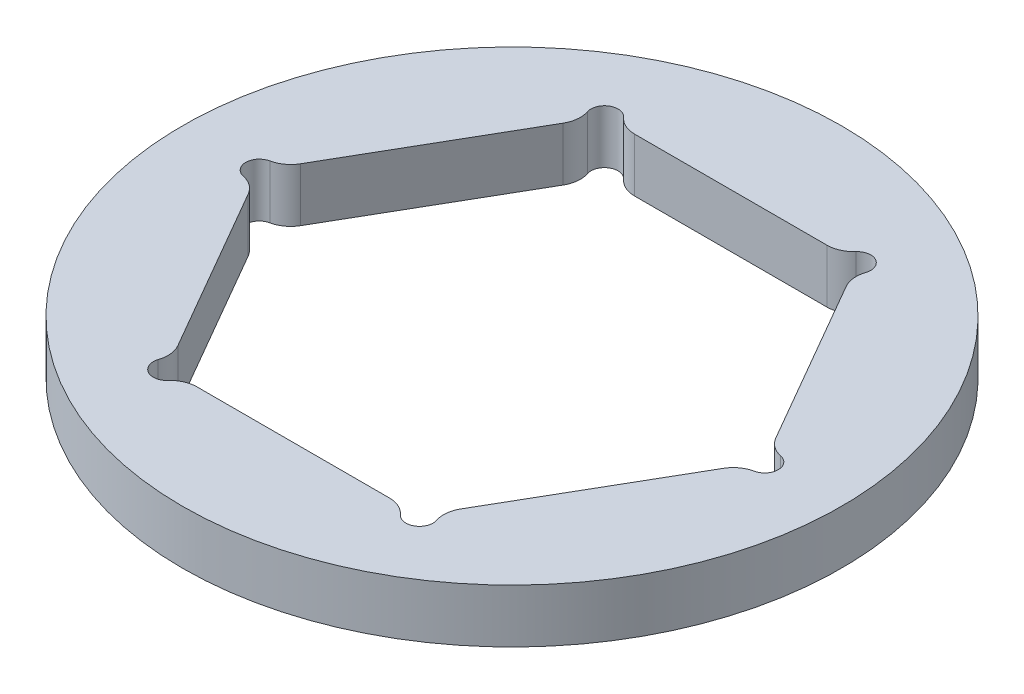
ISO-10303-21;
HEADER;
FILE_DESCRIPTION(('STEP AP214'),'2;1');
FILE_NAME('part.step','',(''),(''),'','','');
FILE_SCHEMA(('AUTOMOTIVE_DESIGN { 1 0 10303 214 1 1 1 1 }'));
ENDSEC;
DATA;
#1=APPLICATION_CONTEXT('core data for automotive mechanical design processes');
#2=APPLICATION_PROTOCOL_DEFINITION('international standard','automotive_design',2000,#1);
#3=PRODUCT_CONTEXT('',#1,'mechanical');
#4=PRODUCT('Part','Part','',(#3));
#5=PRODUCT_RELATED_PRODUCT_CATEGORY('part','',(#4));
#6=PRODUCT_DEFINITION_FORMATION('','',#4);
#7=PRODUCT_DEFINITION_CONTEXT('part definition',#1,'design');
#8=PRODUCT_DEFINITION('design','',#6,#7);
#9=PRODUCT_DEFINITION_SHAPE('','',#8);
#10=(LENGTH_UNIT() NAMED_UNIT(*) SI_UNIT(.MILLI.,.METRE.));
#11=(NAMED_UNIT(*) PLANE_ANGLE_UNIT() SI_UNIT($,.RADIAN.));
#12=(NAMED_UNIT(*) SI_UNIT($,.STERADIAN.) SOLID_ANGLE_UNIT());
#13=UNCERTAINTY_MEASURE_WITH_UNIT(LENGTH_MEASURE(1.E-05),#10,'distance_accuracy_value','');
#14=(GEOMETRIC_REPRESENTATION_CONTEXT(3) GLOBAL_UNCERTAINTY_ASSIGNED_CONTEXT((#13)) GLOBAL_UNIT_ASSIGNED_CONTEXT((#10,
#11,#12)) REPRESENTATION_CONTEXT('',''));
#15=CARTESIAN_POINT('',(0.,0.,0.));
#16=DIRECTION('',(0.,0.,1.));
#17=DIRECTION('',(1.,0.,0.));
#18=AXIS2_PLACEMENT_3D('',#15,#16,#17);
#19=CARTESIAN_POINT('',(0.,0.79375,0.));
#20=DIRECTION('',(0.,1.,0.));
#21=DIRECTION('',(0.,0.,1.));
#22=AXIS2_PLACEMENT_3D('',#19,#20,#21);
#23=PLANE('',#22);
#24=CARTESIAN_POINT('',(0.,0.79375,0.));
#25=DIRECTION('',(0.,1.,0.));
#26=DIRECTION('',(0.,0.,1.));
#27=AXIS2_PLACEMENT_3D('',#24,#25,#26);
#28=CIRCLE('',#27,9.7536);
#29=CARTESIAN_POINT('',(0.,0.79375,9.7536));
#30=VERTEX_POINT('',#29);
#31=EDGE_CURVE('E11',#30,#30,#28,.T.);
#32=ORIENTED_EDGE('',*,*,#31,.T.);
#33=EDGE_LOOP('',(#32));
#34=FACE_BOUND('',#33,.T.);
#35=CARTESIAN_POINT('',(-3.7394976935412,0.79375,-6.477));
#36=DIRECTION('',(0.,1.,0.));
#37=DIRECTION('',(0.,0.,1.));
#38=AXIS2_PLACEMENT_3D('',#35,#36,#37);
#39=CIRCLE('',#38,0.4);
#40=CARTESIAN_POINT('',(-3.44135529654123,0.79375,-6.74366666666667));
#41=VERTEX_POINT('',#40);
#42=CARTESIAN_POINT('',(-4.11950899971704,0.79375,-6.35213444358617));
#43=VERTEX_POINT('',#42);
#44=EDGE_CURVE('E203',#41,#43,#39,.T.);
#45=ORIENTED_EDGE('',*,*,#44,.F.);
#46=CARTESIAN_POINT('',(-2.84507050254129,0.79375,-7.277));
#47=DIRECTION('',(0.,-1.,0.));
#48=DIRECTION('',(0.,0.,1.));
#49=AXIS2_PLACEMENT_3D('',#46,#47,#48);
#50=CIRCLE('',#49,0.8);
#51=CARTESIAN_POINT('',(-2.84507050254129,0.79375,-6.477));
#52=VERTEX_POINT('',#51);
#53=EDGE_CURVE('E195',#52,#41,#50,.T.);
#54=ORIENTED_EDGE('',*,*,#53,.F.);
#55=DIRECTION('',(-1.,0.,0.));
#56=VECTOR('',#55,1.);
#57=CARTESIAN_POINT('',(2.84507050254129,0.79375,-6.477));
#58=LINE('',#57,#56);
#59=CARTESIAN_POINT('',(2.84507050254129,0.79375,-6.477));
#60=VERTEX_POINT('',#59);
#61=EDGE_CURVE('E259',#60,#52,#58,.T.);
#62=ORIENTED_EDGE('',*,*,#61,.F.);
#63=CARTESIAN_POINT('',(2.84507050254129,0.79375,-7.277));
#64=DIRECTION('',(0.,-1.,0.));
#65=DIRECTION('',(0.,0.,1.));
#66=AXIS2_PLACEMENT_3D('',#63,#64,#65);
#67=CIRCLE('',#66,0.800000000000002);
#68=CARTESIAN_POINT('',(3.44135529654124,0.79375,-6.74366666666666));
#69=VERTEX_POINT('',#68);
#70=EDGE_CURVE('E257',#69,#60,#67,.T.);
#71=ORIENTED_EDGE('',*,*,#70,.F.);
#72=CARTESIAN_POINT('',(3.73949769354121,0.79375,-6.477));
#73=DIRECTION('',(0.,1.,0.));
#74=DIRECTION('',(0.,0.,1.));
#75=AXIS2_PLACEMENT_3D('',#72,#73,#74);
#76=CIRCLE('',#75,0.4);
#77=CARTESIAN_POINT('',(4.11950899971704,0.79375,-6.35213444358617));
#78=VERTEX_POINT('',#77);
#79=EDGE_CURVE('E255',#78,#69,#76,.T.);
#80=ORIENTED_EDGE('',*,*,#79,.F.);
#81=CARTESIAN_POINT('',(4.87953161206872,0.79375,-6.10240333075852));
#82=DIRECTION('',(0.,-1.,0.));
#83=DIRECTION('',(0.,0.,1.));
#84=AXIS2_PLACEMENT_3D('',#81,#82,#83);
#85=CIRCLE('',#84,0.799999999999999);
#86=CARTESIAN_POINT('',(4.18671128904117,0.79375,-5.70240333075852));
#87=VERTEX_POINT('',#86);
#88=EDGE_CURVE('E253',#87,#78,#85,.T.);
#89=ORIENTED_EDGE('',*,*,#88,.F.);
#90=DIRECTION('',(-0.5,0.,-0.866025403784439));
#91=VECTOR('',#90,1.);
#92=CARTESIAN_POINT('',(7.03178179158246,0.79375,-0.77459666924148));
#93=LINE('',#92,#91);
#94=CARTESIAN_POINT('',(7.03178179158246,0.79375,-0.77459666924148));
#95=VERTEX_POINT('',#94);
#96=EDGE_CURVE('E251',#95,#87,#93,.T.);
#97=ORIENTED_EDGE('',*,*,#96,.F.);
#98=CARTESIAN_POINT('',(7.72460211461001,0.79375,-1.17459666924148));
#99=DIRECTION('',(0.,-1.,0.));
#100=DIRECTION('',(0.,0.,1.));
#101=AXIS2_PLACEMENT_3D('',#98,#99,#100);
#102=CIRCLE('',#101,0.800000000000001);
#103=CARTESIAN_POINT('',(7.56086429625828,0.79375,-0.391532223080492));
#104=VERTEX_POINT('',#103);
#105=EDGE_CURVE('E249',#104,#95,#102,.T.);
#106=ORIENTED_EDGE('',*,*,#105,.F.);
#107=CARTESIAN_POINT('',(7.47899538708241,0.79375,0.));
#108=DIRECTION('',(0.,1.,0.));
#109=DIRECTION('',(0.,0.,1.));
#110=AXIS2_PLACEMENT_3D('',#107,#108,#109);
#111=CIRCLE('',#110,0.4);
#112=CARTESIAN_POINT('',(7.56086429625828,0.79375,0.391532223080496));
#113=VERTEX_POINT('',#112);
#114=EDGE_CURVE('E247',#113,#104,#111,.T.);
#115=ORIENTED_EDGE('',*,*,#114,.F.);
#116=CARTESIAN_POINT('',(7.72460211461001,0.79375,1.17459666924148));
#117=DIRECTION('',(0.,-1.,0.));
#118=DIRECTION('',(0.,0.,1.));
#119=AXIS2_PLACEMENT_3D('',#116,#117,#118);
#120=CIRCLE('',#119,0.8);
#121=CARTESIAN_POINT('',(7.03178179158246,0.79375,0.774596669241483));
#122=VERTEX_POINT('',#121);
#123=EDGE_CURVE('E245',#122,#113,#120,.T.);
#124=ORIENTED_EDGE('',*,*,#123,.F.);
#125=DIRECTION('',(0.5,0.,-0.866025403784438));
#126=VECTOR('',#125,1.);
#127=CARTESIAN_POINT('',(4.18671128904117,0.79375,5.70240333075852));
#128=LINE('',#127,#126);
#129=CARTESIAN_POINT('',(4.18671128904117,0.79375,5.70240333075852));
#130=VERTEX_POINT('',#129);
#131=EDGE_CURVE('E243',#130,#122,#128,.T.);
#132=ORIENTED_EDGE('',*,*,#131,.F.);
#133=CARTESIAN_POINT('',(4.87953161206872,0.79375,6.10240333075852));
#134=DIRECTION('',(0.,-1.,0.));
#135=DIRECTION('',(0.,0.,1.));
#136=AXIS2_PLACEMENT_3D('',#133,#134,#135);
#137=CIRCLE('',#136,0.800000000000001);
#138=CARTESIAN_POINT('',(4.11950899971704,0.79375,6.35213444358617));
#139=VERTEX_POINT('',#138);
#140=EDGE_CURVE('E241',#139,#130,#137,.T.);
#141=ORIENTED_EDGE('',*,*,#140,.F.);
#142=CARTESIAN_POINT('',(3.73949769354121,0.79375,6.477));
#143=DIRECTION('',(0.,1.,0.));
#144=DIRECTION('',(0.,0.,1.));
#145=AXIS2_PLACEMENT_3D('',#142,#143,#144);
#146=CIRCLE('',#145,0.4);
#147=CARTESIAN_POINT('',(3.44135529654124,0.79375,6.74366666666667));
#148=VERTEX_POINT('',#147);
#149=EDGE_CURVE('E239',#148,#139,#146,.T.);
#150=ORIENTED_EDGE('',*,*,#149,.F.);
#151=CARTESIAN_POINT('',(2.8450705025413,0.79375,7.277));
#152=DIRECTION('',(0.,-1.,0.));
#153=DIRECTION('',(0.,0.,1.));
#154=AXIS2_PLACEMENT_3D('',#151,#152,#153);
#155=CIRCLE('',#154,0.799999999999996);
#156=CARTESIAN_POINT('',(2.8450705025413,0.79375,6.477));
#157=VERTEX_POINT('',#156);
#158=EDGE_CURVE('E237',#157,#148,#155,.T.);
#159=ORIENTED_EDGE('',*,*,#158,.F.);
#160=DIRECTION('',(1.,0.,0.));
#161=VECTOR('',#160,1.);
#162=CARTESIAN_POINT('',(-2.84507050254129,0.79375,6.477));
#163=LINE('',#162,#161);
#164=CARTESIAN_POINT('',(-2.84507050254129,0.79375,6.477));
#165=VERTEX_POINT('',#164);
#166=EDGE_CURVE('E235',#165,#157,#163,.T.);
#167=ORIENTED_EDGE('',*,*,#166,.F.);
#168=CARTESIAN_POINT('',(-2.84507050254129,0.79375,7.277));
#169=DIRECTION('',(0.,-1.,0.));
#170=DIRECTION('',(0.,0.,1.));
#171=AXIS2_PLACEMENT_3D('',#168,#169,#170);
#172=CIRCLE('',#171,0.799999999999998);
#173=CARTESIAN_POINT('',(-3.44135529654123,0.79375,6.74366666666667));
#174=VERTEX_POINT('',#173);
#175=EDGE_CURVE('E233',#174,#165,#172,.T.);
#176=ORIENTED_EDGE('',*,*,#175,.F.);
#177=CARTESIAN_POINT('',(-3.7394976935412,0.79375,6.477));
#178=DIRECTION('',(0.,1.,0.));
#179=DIRECTION('',(0.,0.,1.));
#180=AXIS2_PLACEMENT_3D('',#177,#178,#179);
#181=CIRCLE('',#180,0.4);
#182=CARTESIAN_POINT('',(-4.11950899971704,0.79375,6.35213444358618));
#183=VERTEX_POINT('',#182);
#184=EDGE_CURVE('E231',#183,#174,#181,.T.);
#185=ORIENTED_EDGE('',*,*,#184,.F.);
#186=CARTESIAN_POINT('',(-4.87953161206871,0.79375,6.10240333075852));
#187=DIRECTION('',(0.,-1.,0.));
#188=DIRECTION('',(0.,0.,1.));
#189=AXIS2_PLACEMENT_3D('',#186,#187,#188);
#190=CIRCLE('',#189,0.8);
#191=CARTESIAN_POINT('',(-4.18671128904116,0.79375,5.70240333075852));
#192=VERTEX_POINT('',#191);
#193=EDGE_CURVE('E229',#192,#183,#190,.T.);
#194=ORIENTED_EDGE('',*,*,#193,.F.);
#195=DIRECTION('',(0.5,0.,0.866025403784438));
#196=VECTOR('',#195,1.);
#197=CARTESIAN_POINT('',(-7.03178179158245,0.79375,0.774596669241489));
#198=LINE('',#197,#196);
#199=CARTESIAN_POINT('',(-7.03178179158245,0.79375,0.774596669241489));
#200=VERTEX_POINT('',#199);
#201=EDGE_CURVE('E227',#200,#192,#198,.T.);
#202=ORIENTED_EDGE('',*,*,#201,.F.);
#203=CARTESIAN_POINT('',(-7.72460211461,0.79375,1.17459666924149));
#204=DIRECTION('',(0.,-1.,0.));
#205=DIRECTION('',(0.,0.,1.));
#206=AXIS2_PLACEMENT_3D('',#203,#204,#205);
#207=CIRCLE('',#206,0.8);
#208=CARTESIAN_POINT('',(-7.56086429625827,0.79375,0.3915322230805));
#209=VERTEX_POINT('',#208);
#210=EDGE_CURVE('E225',#209,#200,#207,.T.);
#211=ORIENTED_EDGE('',*,*,#210,.F.);
#212=CARTESIAN_POINT('',(-7.47899538708241,0.79375,0.));
#213=DIRECTION('',(0.,1.,0.));
#214=DIRECTION('',(0.,0.,1.));
#215=AXIS2_PLACEMENT_3D('',#212,#213,#214);
#216=CIRCLE('',#215,0.4);
#217=CARTESIAN_POINT('',(-7.56086429625827,0.79375,-0.391532223080488));
#218=VERTEX_POINT('',#217);
#219=EDGE_CURVE('E223',#218,#209,#216,.T.);
#220=ORIENTED_EDGE('',*,*,#219,.F.);
#221=CARTESIAN_POINT('',(-7.72460211461001,0.79375,-1.17459666924148));
#222=DIRECTION('',(0.,-1.,0.));
#223=DIRECTION('',(0.,0.,1.));
#224=AXIS2_PLACEMENT_3D('',#221,#222,#223);
#225=CIRCLE('',#224,0.8);
#226=CARTESIAN_POINT('',(-7.03178179158246,0.79375,-0.774596669241475));
#227=VERTEX_POINT('',#226);
#228=EDGE_CURVE('E221',#227,#218,#225,.T.);
#229=ORIENTED_EDGE('',*,*,#228,.F.);
#230=DIRECTION('',(-0.5,0.,0.866025403784438));
#231=VECTOR('',#230,1.);
#232=CARTESIAN_POINT('',(-4.18671128904116,0.79375,-5.70240333075852));
#233=LINE('',#232,#231);
#234=CARTESIAN_POINT('',(-4.18671128904116,0.79375,-5.70240333075852));
#235=VERTEX_POINT('',#234);
#236=EDGE_CURVE('E217',#235,#227,#233,.T.);
#237=ORIENTED_EDGE('',*,*,#236,.F.);
#238=CARTESIAN_POINT('',(-4.87953161206871,0.79375,-6.10240333075852));
#239=DIRECTION('',(0.,-1.,0.));
#240=DIRECTION('',(0.,0.,1.));
#241=AXIS2_PLACEMENT_3D('',#238,#239,#240);
#242=CIRCLE('',#241,0.8);
#243=EDGE_CURVE('E215',#43,#235,#242,.T.);
#244=ORIENTED_EDGE('',*,*,#243,.F.);
#245=EDGE_LOOP('',(#45,#54,#62,#71,#80,#89,#97,#106,#115,#124,#132,#141,#150,#159,#167,#176,
#185,#194,#202,#211,#220,#229,#237,#244));
#246=FACE_BOUND('',#245,.T.);
#247=ADVANCED_FACE('F34',(#34,#246),#23,.T.);
#248=CARTESIAN_POINT('',(0.,-0.79375,0.));
#249=DIRECTION('',(0.,1.,0.));
#250=DIRECTION('',(0.,0.,1.));
#251=AXIS2_PLACEMENT_3D('',#248,#249,#250);
#252=PLANE('',#251);
#253=CARTESIAN_POINT('',(0.,-0.79375,0.));
#254=DIRECTION('',(0.,1.,0.));
#255=DIRECTION('',(0.,0.,1.));
#256=AXIS2_PLACEMENT_3D('',#253,#254,#255);
#257=CIRCLE('',#256,9.7536);
#258=CARTESIAN_POINT('',(0.,-0.79375,9.7536));
#259=VERTEX_POINT('',#258);
#260=EDGE_CURVE('E38',#259,#259,#257,.T.);
#261=ORIENTED_EDGE('',*,*,#260,.F.);
#262=EDGE_LOOP('',(#261));
#263=FACE_BOUND('',#262,.T.);
#264=CARTESIAN_POINT('',(-2.84507050254129,-0.79375,-7.277));
#265=DIRECTION('',(0.,-1.,0.));
#266=DIRECTION('',(0.,0.,1.));
#267=AXIS2_PLACEMENT_3D('',#264,#265,#266);
#268=CIRCLE('',#267,0.8);
#269=CARTESIAN_POINT('',(-2.84507050254129,-0.79375,-6.477));
#270=VERTEX_POINT('',#269);
#271=CARTESIAN_POINT('',(-3.44135529654123,-0.79375,-6.74366666666667));
#272=VERTEX_POINT('',#271);
#273=EDGE_CURVE('E57',#270,#272,#268,.T.);
#274=ORIENTED_EDGE('',*,*,#273,.T.);
#275=CARTESIAN_POINT('',(-3.7394976935412,-0.79375,-6.477));
#276=DIRECTION('',(0.,1.,0.));
#277=DIRECTION('',(0.,0.,1.));
#278=AXIS2_PLACEMENT_3D('',#275,#276,#277);
#279=CIRCLE('',#278,0.4);
#280=CARTESIAN_POINT('',(-4.11950899971704,-0.79375,-6.35213444358617));
#281=VERTEX_POINT('',#280);
#282=EDGE_CURVE('E210',#272,#281,#279,.T.);
#283=ORIENTED_EDGE('',*,*,#282,.T.);
#284=CARTESIAN_POINT('',(-4.87953161206871,-0.79375,-6.10240333075852));
#285=DIRECTION('',(0.,-1.,0.));
#286=DIRECTION('',(0.,0.,1.));
#287=AXIS2_PLACEMENT_3D('',#284,#285,#286);
#288=CIRCLE('',#287,0.8);
#289=CARTESIAN_POINT('',(-4.18671128904116,-0.79375,-5.70240333075852));
#290=VERTEX_POINT('',#289);
#291=EDGE_CURVE('E263',#281,#290,#288,.T.);
#292=ORIENTED_EDGE('',*,*,#291,.T.);
#293=DIRECTION('',(-0.5,0.,0.866025403784438));
#294=VECTOR('',#293,1.);
#295=CARTESIAN_POINT('',(-4.18671128904116,-0.79375,-5.70240333075852));
#296=LINE('',#295,#294);
#297=CARTESIAN_POINT('',(-7.03178179158246,-0.79375,-0.774596669241475));
#298=VERTEX_POINT('',#297);
#299=EDGE_CURVE('E266',#290,#298,#296,.T.);
#300=ORIENTED_EDGE('',*,*,#299,.T.);
#301=CARTESIAN_POINT('',(-7.72460211461001,-0.79375,-1.17459666924148));
#302=DIRECTION('',(0.,-1.,0.));
#303=DIRECTION('',(0.,0.,1.));
#304=AXIS2_PLACEMENT_3D('',#301,#302,#303);
#305=CIRCLE('',#304,0.8);
#306=CARTESIAN_POINT('',(-7.56086429625827,-0.79375,-0.391532223080488));
#307=VERTEX_POINT('',#306);
#308=EDGE_CURVE('E269',#298,#307,#305,.T.);
#309=ORIENTED_EDGE('',*,*,#308,.T.);
#310=CARTESIAN_POINT('',(-7.47899538708241,-0.79375,0.));
#311=DIRECTION('',(0.,1.,0.));
#312=DIRECTION('',(0.,0.,1.));
#313=AXIS2_PLACEMENT_3D('',#310,#311,#312);
#314=CIRCLE('',#313,0.4);
#315=CARTESIAN_POINT('',(-7.56086429625827,-0.79375,0.3915322230805));
#316=VERTEX_POINT('',#315);
#317=EDGE_CURVE('E272',#307,#316,#314,.T.);
#318=ORIENTED_EDGE('',*,*,#317,.T.);
#319=CARTESIAN_POINT('',(-7.72460211461,-0.79375,1.17459666924149));
#320=DIRECTION('',(0.,-1.,0.));
#321=DIRECTION('',(0.,0.,1.));
#322=AXIS2_PLACEMENT_3D('',#319,#320,#321);
#323=CIRCLE('',#322,0.8);
#324=CARTESIAN_POINT('',(-7.03178179158245,-0.79375,0.774596669241489));
#325=VERTEX_POINT('',#324);
#326=EDGE_CURVE('E275',#316,#325,#323,.T.);
#327=ORIENTED_EDGE('',*,*,#326,.T.);
#328=DIRECTION('',(0.5,0.,0.866025403784438));
#329=VECTOR('',#328,1.);
#330=CARTESIAN_POINT('',(-7.03178179158245,-0.79375,0.774596669241489));
#331=LINE('',#330,#329);
#332=CARTESIAN_POINT('',(-4.18671128904116,-0.79375,5.70240333075852));
#333=VERTEX_POINT('',#332);
#334=EDGE_CURVE('E278',#325,#333,#331,.T.);
#335=ORIENTED_EDGE('',*,*,#334,.T.);
#336=CARTESIAN_POINT('',(-4.87953161206871,-0.79375,6.10240333075852));
#337=DIRECTION('',(0.,-1.,0.));
#338=DIRECTION('',(0.,0.,1.));
#339=AXIS2_PLACEMENT_3D('',#336,#337,#338);
#340=CIRCLE('',#339,0.8);
#341=CARTESIAN_POINT('',(-4.11950899971704,-0.79375,6.35213444358618));
#342=VERTEX_POINT('',#341);
#343=EDGE_CURVE('E281',#333,#342,#340,.T.);
#344=ORIENTED_EDGE('',*,*,#343,.T.);
#345=CARTESIAN_POINT('',(-3.7394976935412,-0.79375,6.477));
#346=DIRECTION('',(0.,1.,0.));
#347=DIRECTION('',(0.,0.,1.));
#348=AXIS2_PLACEMENT_3D('',#345,#346,#347);
#349=CIRCLE('',#348,0.4);
#350=CARTESIAN_POINT('',(-3.44135529654123,-0.79375,6.74366666666667));
#351=VERTEX_POINT('',#350);
#352=EDGE_CURVE('E284',#342,#351,#349,.T.);
#353=ORIENTED_EDGE('',*,*,#352,.T.);
#354=CARTESIAN_POINT('',(-2.84507050254129,-0.79375,7.277));
#355=DIRECTION('',(0.,-1.,0.));
#356=DIRECTION('',(0.,0.,1.));
#357=AXIS2_PLACEMENT_3D('',#354,#355,#356);
#358=CIRCLE('',#357,0.799999999999998);
#359=CARTESIAN_POINT('',(-2.84507050254129,-0.79375,6.477));
#360=VERTEX_POINT('',#359);
#361=EDGE_CURVE('E287',#351,#360,#358,.T.);
#362=ORIENTED_EDGE('',*,*,#361,.T.);
#363=DIRECTION('',(1.,0.,0.));
#364=VECTOR('',#363,1.);
#365=CARTESIAN_POINT('',(-2.84507050254129,-0.79375,6.477));
#366=LINE('',#365,#364);
#367=CARTESIAN_POINT('',(2.8450705025413,-0.79375,6.477));
#368=VERTEX_POINT('',#367);
#369=EDGE_CURVE('E290',#360,#368,#366,.T.);
#370=ORIENTED_EDGE('',*,*,#369,.T.);
#371=CARTESIAN_POINT('',(2.8450705025413,-0.79375,7.277));
#372=DIRECTION('',(0.,-1.,0.));
#373=DIRECTION('',(0.,0.,1.));
#374=AXIS2_PLACEMENT_3D('',#371,#372,#373);
#375=CIRCLE('',#374,0.799999999999996);
#376=CARTESIAN_POINT('',(3.44135529654124,-0.79375,6.74366666666667));
#377=VERTEX_POINT('',#376);
#378=EDGE_CURVE('E293',#368,#377,#375,.T.);
#379=ORIENTED_EDGE('',*,*,#378,.T.);
#380=CARTESIAN_POINT('',(3.73949769354121,-0.79375,6.477));
#381=DIRECTION('',(0.,1.,0.));
#382=DIRECTION('',(0.,0.,1.));
#383=AXIS2_PLACEMENT_3D('',#380,#381,#382);
#384=CIRCLE('',#383,0.4);
#385=CARTESIAN_POINT('',(4.11950899971704,-0.79375,6.35213444358617));
#386=VERTEX_POINT('',#385);
#387=EDGE_CURVE('E296',#377,#386,#384,.T.);
#388=ORIENTED_EDGE('',*,*,#387,.T.);
#389=CARTESIAN_POINT('',(4.87953161206872,-0.79375,6.10240333075852));
#390=DIRECTION('',(0.,-1.,0.));
#391=DIRECTION('',(0.,0.,1.));
#392=AXIS2_PLACEMENT_3D('',#389,#390,#391);
#393=CIRCLE('',#392,0.800000000000001);
#394=CARTESIAN_POINT('',(4.18671128904117,-0.79375,5.70240333075852));
#395=VERTEX_POINT('',#394);
#396=EDGE_CURVE('E299',#386,#395,#393,.T.);
#397=ORIENTED_EDGE('',*,*,#396,.T.);
#398=DIRECTION('',(0.5,0.,-0.866025403784438));
#399=VECTOR('',#398,1.);
#400=CARTESIAN_POINT('',(4.18671128904117,-0.79375,5.70240333075852));
#401=LINE('',#400,#399);
#402=CARTESIAN_POINT('',(7.03178179158246,-0.79375,0.774596669241483));
#403=VERTEX_POINT('',#402);
#404=EDGE_CURVE('E302',#395,#403,#401,.T.);
#405=ORIENTED_EDGE('',*,*,#404,.T.);
#406=CARTESIAN_POINT('',(7.72460211461001,-0.79375,1.17459666924148));
#407=DIRECTION('',(0.,-1.,0.));
#408=DIRECTION('',(0.,0.,1.));
#409=AXIS2_PLACEMENT_3D('',#406,#407,#408);
#410=CIRCLE('',#409,0.8);
#411=CARTESIAN_POINT('',(7.56086429625828,-0.79375,0.391532223080496));
#412=VERTEX_POINT('',#411);
#413=EDGE_CURVE('E305',#403,#412,#410,.T.);
#414=ORIENTED_EDGE('',*,*,#413,.T.);
#415=CARTESIAN_POINT('',(7.47899538708241,-0.79375,0.));
#416=DIRECTION('',(0.,1.,0.));
#417=DIRECTION('',(0.,0.,1.));
#418=AXIS2_PLACEMENT_3D('',#415,#416,#417);
#419=CIRCLE('',#418,0.4);
#420=CARTESIAN_POINT('',(7.56086429625828,-0.79375,-0.391532223080492));
#421=VERTEX_POINT('',#420);
#422=EDGE_CURVE('E308',#412,#421,#419,.T.);
#423=ORIENTED_EDGE('',*,*,#422,.T.);
#424=CARTESIAN_POINT('',(7.72460211461001,-0.79375,-1.17459666924148));
#425=DIRECTION('',(0.,-1.,0.));
#426=DIRECTION('',(0.,0.,1.));
#427=AXIS2_PLACEMENT_3D('',#424,#425,#426);
#428=CIRCLE('',#427,0.800000000000001);
#429=CARTESIAN_POINT('',(7.03178179158246,-0.79375,-0.77459666924148));
#430=VERTEX_POINT('',#429);
#431=EDGE_CURVE('E311',#421,#430,#428,.T.);
#432=ORIENTED_EDGE('',*,*,#431,.T.);
#433=DIRECTION('',(-0.5,0.,-0.866025403784439));
#434=VECTOR('',#433,1.);
#435=CARTESIAN_POINT('',(7.03178179158246,-0.79375,-0.77459666924148));
#436=LINE('',#435,#434);
#437=CARTESIAN_POINT('',(4.18671128904117,-0.79375,-5.70240333075852));
#438=VERTEX_POINT('',#437);
#439=EDGE_CURVE('E314',#430,#438,#436,.T.);
#440=ORIENTED_EDGE('',*,*,#439,.T.);
#441=CARTESIAN_POINT('',(4.87953161206872,-0.79375,-6.10240333075852));
#442=DIRECTION('',(0.,-1.,0.));
#443=DIRECTION('',(0.,0.,1.));
#444=AXIS2_PLACEMENT_3D('',#441,#442,#443);
#445=CIRCLE('',#444,0.799999999999999);
#446=CARTESIAN_POINT('',(4.11950899971704,-0.79375,-6.35213444358617));
#447=VERTEX_POINT('',#446);
#448=EDGE_CURVE('E317',#438,#447,#445,.T.);
#449=ORIENTED_EDGE('',*,*,#448,.T.);
#450=CARTESIAN_POINT('',(3.73949769354121,-0.79375,-6.477));
#451=DIRECTION('',(0.,1.,0.));
#452=DIRECTION('',(0.,0.,1.));
#453=AXIS2_PLACEMENT_3D('',#450,#451,#452);
#454=CIRCLE('',#453,0.4);
#455=CARTESIAN_POINT('',(3.44135529654124,-0.79375,-6.74366666666666));
#456=VERTEX_POINT('',#455);
#457=EDGE_CURVE('E320',#447,#456,#454,.T.);
#458=ORIENTED_EDGE('',*,*,#457,.T.);
#459=CARTESIAN_POINT('',(2.84507050254129,-0.79375,-7.277));
#460=DIRECTION('',(0.,-1.,0.));
#461=DIRECTION('',(0.,0.,1.));
#462=AXIS2_PLACEMENT_3D('',#459,#460,#461);
#463=CIRCLE('',#462,0.800000000000002);
#464=CARTESIAN_POINT('',(2.84507050254129,-0.79375,-6.477));
#465=VERTEX_POINT('',#464);
#466=EDGE_CURVE('E323',#456,#465,#463,.T.);
#467=ORIENTED_EDGE('',*,*,#466,.T.);
#468=DIRECTION('',(-1.,0.,0.));
#469=VECTOR('',#468,1.);
#470=CARTESIAN_POINT('',(2.84507050254129,-0.79375,-6.477));
#471=LINE('',#470,#469);
#472=EDGE_CURVE('E204',#465,#270,#471,.T.);
#473=ORIENTED_EDGE('',*,*,#472,.T.);
#474=EDGE_LOOP('',(#274,#283,#292,#300,#309,#318,#327,#335,#344,#353,#362,#370,#379,#388,#397,
#405,#414,#423,#432,#440,#449,#458,#467,#473));
#475=FACE_BOUND('',#474,.T.);
#476=ADVANCED_FACE('F376',(#263,#475),#252,.F.);
#477=CARTESIAN_POINT('',(0.,0.79375,0.));
#478=DIRECTION('',(0.,-1.,0.));
#479=DIRECTION('',(0.,0.,-1.));
#480=AXIS2_PLACEMENT_3D('',#477,#478,#479);
#481=CYLINDRICAL_SURFACE('',#480,9.7536);
#482=ORIENTED_EDGE('',*,*,#31,.F.);
#483=EDGE_LOOP('',(#482));
#484=FACE_BOUND('',#483,.T.);
#485=ORIENTED_EDGE('',*,*,#260,.T.);
#486=EDGE_LOOP('',(#485));
#487=FACE_BOUND('',#486,.T.);
#488=ADVANCED_FACE('F36',(#484,#487),#481,.T.);
#489=CARTESIAN_POINT('',(-2.84507050254129,0.79375,-7.277));
#490=DIRECTION('',(0.,-1.,0.));
#491=DIRECTION('',(0.,0.,-1.));
#492=AXIS2_PLACEMENT_3D('',#489,#490,#491);
#493=CYLINDRICAL_SURFACE('',#492,0.8);
#494=ORIENTED_EDGE('',*,*,#273,.F.);
#495=DIRECTION('',(0.,-1.,0.));
#496=VECTOR('',#495,1.);
#497=CARTESIAN_POINT('',(-2.84507050254129,0.79375,-6.477));
#498=LINE('',#497,#496);
#499=EDGE_CURVE('E199',#52,#270,#498,.T.);
#500=ORIENTED_EDGE('',*,*,#499,.F.);
#501=ORIENTED_EDGE('',*,*,#53,.T.);
#502=DIRECTION('',(0.,-1.,0.));
#503=VECTOR('',#502,1.);
#504=CARTESIAN_POINT('',(-3.44135529654123,0.79375,-6.74366666666667));
#505=LINE('',#504,#503);
#506=EDGE_CURVE('E198',#41,#272,#505,.T.);
#507=ORIENTED_EDGE('',*,*,#506,.T.);
#508=EDGE_LOOP('',(#494,#500,#501,#507));
#509=FACE_BOUND('',#508,.T.);
#510=ADVANCED_FACE('F197',(#509),#493,.T.);
#511=CARTESIAN_POINT('',(-3.7394976935412,0.79375,-6.477));
#512=DIRECTION('',(0.,-1.,0.));
#513=DIRECTION('',(0.,0.,-1.));
#514=AXIS2_PLACEMENT_3D('',#511,#512,#513);
#515=CYLINDRICAL_SURFACE('',#514,0.4);
#516=ORIENTED_EDGE('',*,*,#282,.F.);
#517=ORIENTED_EDGE('',*,*,#506,.F.);
#518=ORIENTED_EDGE('',*,*,#44,.T.);
#519=DIRECTION('',(0.,-1.,0.));
#520=VECTOR('',#519,1.);
#521=CARTESIAN_POINT('',(-4.11950899971704,0.79375,-6.35213444358617));
#522=LINE('',#521,#520);
#523=EDGE_CURVE('E211',#43,#281,#522,.T.);
#524=ORIENTED_EDGE('',*,*,#523,.T.);
#525=EDGE_LOOP('',(#516,#517,#518,#524));
#526=FACE_BOUND('',#525,.T.);
#527=ADVANCED_FACE('F207',(#526),#515,.F.);
#528=CARTESIAN_POINT('',(-4.87953161206871,0.79375,-6.10240333075852));
#529=DIRECTION('',(0.,-1.,0.));
#530=DIRECTION('',(0.,0.,-1.));
#531=AXIS2_PLACEMENT_3D('',#528,#529,#530);
#532=CYLINDRICAL_SURFACE('',#531,0.8);
#533=ORIENTED_EDGE('',*,*,#291,.F.);
#534=ORIENTED_EDGE('',*,*,#523,.F.);
#535=ORIENTED_EDGE('',*,*,#243,.T.);
#536=DIRECTION('',(0.,-1.,0.));
#537=VECTOR('',#536,1.);
#538=CARTESIAN_POINT('',(-4.18671128904116,0.79375,-5.70240333075852));
#539=LINE('',#538,#537);
#540=EDGE_CURVE('E368',#235,#290,#539,.T.);
#541=ORIENTED_EDGE('',*,*,#540,.T.);
#542=EDGE_LOOP('',(#533,#534,#535,#541));
#543=FACE_BOUND('',#542,.T.);
#544=ADVANCED_FACE('F372',(#543),#532,.T.);
#545=CARTESIAN_POINT('',(-4.18671128904116,0.79375,-5.70240333075852));
#546=DIRECTION('',(0.866025403784439,0.,0.5));
#547=DIRECTION('',(0.5,0.,-0.866025403784439));
#548=AXIS2_PLACEMENT_3D('',#545,#546,#547);
#549=PLANE('',#548);
#550=ORIENTED_EDGE('',*,*,#299,.F.);
#551=ORIENTED_EDGE('',*,*,#540,.F.);
#552=ORIENTED_EDGE('',*,*,#236,.T.);
#553=DIRECTION('',(0.,-1.,0.));
#554=VECTOR('',#553,1.);
#555=CARTESIAN_POINT('',(-7.03178179158246,0.79375,-0.774596669241475));
#556=LINE('',#555,#554);
#557=EDGE_CURVE('E366',#227,#298,#556,.T.);
#558=ORIENTED_EDGE('',*,*,#557,.T.);
#559=EDGE_LOOP('',(#550,#551,#552,#558));
#560=FACE_BOUND('',#559,.T.);
#561=ADVANCED_FACE('F474',(#560),#549,.T.);
#562=CARTESIAN_POINT('',(-7.72460211461001,0.79375,-1.17459666924148));
#563=DIRECTION('',(0.,-1.,0.));
#564=DIRECTION('',(0.,0.,-1.));
#565=AXIS2_PLACEMENT_3D('',#562,#563,#564);
#566=CYLINDRICAL_SURFACE('',#565,0.8);
#567=ORIENTED_EDGE('',*,*,#308,.F.);
#568=ORIENTED_EDGE('',*,*,#557,.F.);
#569=ORIENTED_EDGE('',*,*,#228,.T.);
#570=DIRECTION('',(0.,-1.,0.));
#571=VECTOR('',#570,1.);
#572=CARTESIAN_POINT('',(-7.56086429625827,0.79375,-0.391532223080488));
#573=LINE('',#572,#571);
#574=EDGE_CURVE('E364',#218,#307,#573,.T.);
#575=ORIENTED_EDGE('',*,*,#574,.T.);
#576=EDGE_LOOP('',(#567,#568,#569,#575));
#577=FACE_BOUND('',#576,.T.);
#578=ADVANCED_FACE('F472',(#577),#566,.T.);
#579=CARTESIAN_POINT('',(-7.47899538708241,0.79375,0.));
#580=DIRECTION('',(0.,-1.,0.));
#581=DIRECTION('',(0.,0.,-1.));
#582=AXIS2_PLACEMENT_3D('',#579,#580,#581);
#583=CYLINDRICAL_SURFACE('',#582,0.4);
#584=ORIENTED_EDGE('',*,*,#317,.F.);
#585=ORIENTED_EDGE('',*,*,#574,.F.);
#586=ORIENTED_EDGE('',*,*,#219,.T.);
#587=DIRECTION('',(0.,-1.,0.));
#588=VECTOR('',#587,1.);
#589=CARTESIAN_POINT('',(-7.56086429625827,0.79375,0.3915322230805));
#590=LINE('',#589,#588);
#591=EDGE_CURVE('E362',#209,#316,#590,.T.);
#592=ORIENTED_EDGE('',*,*,#591,.T.);
#593=EDGE_LOOP('',(#584,#585,#586,#592));
#594=FACE_BOUND('',#593,.T.);
#595=ADVANCED_FACE('F466',(#594),#583,.F.);
#596=CARTESIAN_POINT('',(-7.72460211461,0.79375,1.17459666924149));
#597=DIRECTION('',(0.,-1.,0.));
#598=DIRECTION('',(0.,0.,-1.));
#599=AXIS2_PLACEMENT_3D('',#596,#597,#598);
#600=CYLINDRICAL_SURFACE('',#599,0.8);
#601=ORIENTED_EDGE('',*,*,#326,.F.);
#602=ORIENTED_EDGE('',*,*,#591,.F.);
#603=ORIENTED_EDGE('',*,*,#210,.T.);
#604=DIRECTION('',(0.,-1.,0.));
#605=VECTOR('',#604,1.);
#606=CARTESIAN_POINT('',(-7.03178179158245,0.79375,0.774596669241489));
#607=LINE('',#606,#605);
#608=EDGE_CURVE('E360',#200,#325,#607,.T.);
#609=ORIENTED_EDGE('',*,*,#608,.T.);
#610=EDGE_LOOP('',(#601,#602,#603,#609));
#611=FACE_BOUND('',#610,.T.);
#612=ADVANCED_FACE('F462',(#611),#600,.T.);
#613=CARTESIAN_POINT('',(-7.03178179158245,0.79375,0.774596669241489));
#614=DIRECTION('',(0.866025403784438,0.,-0.5));
#615=DIRECTION('',(-0.5,0.,-0.866025403784439));
#616=AXIS2_PLACEMENT_3D('',#613,#614,#615);
#617=PLANE('',#616);
#618=ORIENTED_EDGE('',*,*,#334,.F.);
#619=ORIENTED_EDGE('',*,*,#608,.F.);
#620=ORIENTED_EDGE('',*,*,#201,.T.);
#621=DIRECTION('',(0.,-1.,0.));
#622=VECTOR('',#621,1.);
#623=CARTESIAN_POINT('',(-4.18671128904116,0.79375,5.70240333075852));
#624=LINE('',#623,#622);
#625=EDGE_CURVE('E358',#192,#333,#624,.T.);
#626=ORIENTED_EDGE('',*,*,#625,.T.);
#627=EDGE_LOOP('',(#618,#619,#620,#626));
#628=FACE_BOUND('',#627,.T.);
#629=ADVANCED_FACE('F459',(#628),#617,.T.);
#630=CARTESIAN_POINT('',(-4.87953161206871,0.79375,6.10240333075852));
#631=DIRECTION('',(0.,-1.,0.));
#632=DIRECTION('',(0.,0.,-1.));
#633=AXIS2_PLACEMENT_3D('',#630,#631,#632);
#634=CYLINDRICAL_SURFACE('',#633,0.8);
#635=ORIENTED_EDGE('',*,*,#343,.F.);
#636=ORIENTED_EDGE('',*,*,#625,.F.);
#637=ORIENTED_EDGE('',*,*,#193,.T.);
#638=DIRECTION('',(0.,-1.,0.));
#639=VECTOR('',#638,1.);
#640=CARTESIAN_POINT('',(-4.11950899971704,0.79375,6.35213444358618));
#641=LINE('',#640,#639);
#642=EDGE_CURVE('E356',#183,#342,#641,.T.);
#643=ORIENTED_EDGE('',*,*,#642,.T.);
#644=EDGE_LOOP('',(#635,#636,#637,#643));
#645=FACE_BOUND('',#644,.T.);
#646=ADVANCED_FACE('F451',(#645),#634,.T.);
#647=CARTESIAN_POINT('',(-3.7394976935412,0.79375,6.477));
#648=DIRECTION('',(0.,-1.,0.));
#649=DIRECTION('',(0.,0.,-1.));
#650=AXIS2_PLACEMENT_3D('',#647,#648,#649);
#651=CYLINDRICAL_SURFACE('',#650,0.4);
#652=ORIENTED_EDGE('',*,*,#352,.F.);
#653=ORIENTED_EDGE('',*,*,#642,.F.);
#654=ORIENTED_EDGE('',*,*,#184,.T.);
#655=DIRECTION('',(0.,-1.,0.));
#656=VECTOR('',#655,1.);
#657=CARTESIAN_POINT('',(-3.44135529654123,0.79375,6.74366666666667));
#658=LINE('',#657,#656);
#659=EDGE_CURVE('E354',#174,#351,#658,.T.);
#660=ORIENTED_EDGE('',*,*,#659,.T.);
#661=EDGE_LOOP('',(#652,#653,#654,#660));
#662=FACE_BOUND('',#661,.T.);
#663=ADVANCED_FACE('F447',(#662),#651,.F.);
#664=CARTESIAN_POINT('',(-2.84507050254129,0.79375,7.277));
#665=DIRECTION('',(0.,-1.,0.));
#666=DIRECTION('',(0.,0.,-1.));
#667=AXIS2_PLACEMENT_3D('',#664,#665,#666);
#668=CYLINDRICAL_SURFACE('',#667,0.799999999999998);
#669=ORIENTED_EDGE('',*,*,#361,.F.);
#670=ORIENTED_EDGE('',*,*,#659,.F.);
#671=ORIENTED_EDGE('',*,*,#175,.T.);
#672=DIRECTION('',(0.,-1.,0.));
#673=VECTOR('',#672,1.);
#674=CARTESIAN_POINT('',(-2.84507050254129,0.79375,6.477));
#675=LINE('',#674,#673);
#676=EDGE_CURVE('E352',#165,#360,#675,.T.);
#677=ORIENTED_EDGE('',*,*,#676,.T.);
#678=EDGE_LOOP('',(#669,#670,#671,#677));
#679=FACE_BOUND('',#678,.T.);
#680=ADVANCED_FACE('F444',(#679),#668,.T.);
#681=CARTESIAN_POINT('',(-2.84507050254129,0.79375,6.477));
#682=DIRECTION('',(0.,0.,-1.));
#683=DIRECTION('',(-1.,0.,0.));
#684=AXIS2_PLACEMENT_3D('',#681,#682,#683);
#685=PLANE('',#684);
#686=ORIENTED_EDGE('',*,*,#369,.F.);
#687=ORIENTED_EDGE('',*,*,#676,.F.);
#688=ORIENTED_EDGE('',*,*,#166,.T.);
#689=DIRECTION('',(0.,-1.,0.));
#690=VECTOR('',#689,1.);
#691=CARTESIAN_POINT('',(2.8450705025413,0.79375,6.477));
#692=LINE('',#691,#690);
#693=EDGE_CURVE('E350',#157,#368,#692,.T.);
#694=ORIENTED_EDGE('',*,*,#693,.T.);
#695=EDGE_LOOP('',(#686,#687,#688,#694));
#696=FACE_BOUND('',#695,.T.);
#697=ADVANCED_FACE('F436',(#696),#685,.T.);
#698=CARTESIAN_POINT('',(2.8450705025413,0.79375,7.277));
#699=DIRECTION('',(0.,-1.,0.));
#700=DIRECTION('',(0.,0.,-1.));
#701=AXIS2_PLACEMENT_3D('',#698,#699,#700);
#702=CYLINDRICAL_SURFACE('',#701,0.799999999999996);
#703=ORIENTED_EDGE('',*,*,#378,.F.);
#704=ORIENTED_EDGE('',*,*,#693,.F.);
#705=ORIENTED_EDGE('',*,*,#158,.T.);
#706=DIRECTION('',(0.,-1.,0.));
#707=VECTOR('',#706,1.);
#708=CARTESIAN_POINT('',(3.44135529654124,0.79375,6.74366666666667));
#709=LINE('',#708,#707);
#710=EDGE_CURVE('E348',#148,#377,#709,.T.);
#711=ORIENTED_EDGE('',*,*,#710,.T.);
#712=EDGE_LOOP('',(#703,#704,#705,#711));
#713=FACE_BOUND('',#712,.T.);
#714=ADVANCED_FACE('F432',(#713),#702,.T.);
#715=CARTESIAN_POINT('',(3.73949769354121,0.79375,6.477));
#716=DIRECTION('',(0.,-1.,0.));
#717=DIRECTION('',(0.,0.,-1.));
#718=AXIS2_PLACEMENT_3D('',#715,#716,#717);
#719=CYLINDRICAL_SURFACE('',#718,0.4);
#720=ORIENTED_EDGE('',*,*,#387,.F.);
#721=ORIENTED_EDGE('',*,*,#710,.F.);
#722=ORIENTED_EDGE('',*,*,#149,.T.);
#723=DIRECTION('',(0.,-1.,0.));
#724=VECTOR('',#723,1.);
#725=CARTESIAN_POINT('',(4.11950899971704,0.79375,6.35213444358617));
#726=LINE('',#725,#724);
#727=EDGE_CURVE('E346',#139,#386,#726,.T.);
#728=ORIENTED_EDGE('',*,*,#727,.T.);
#729=EDGE_LOOP('',(#720,#721,#722,#728));
#730=FACE_BOUND('',#729,.T.);
#731=ADVANCED_FACE('F429',(#730),#719,.F.);
#732=CARTESIAN_POINT('',(4.87953161206872,0.79375,6.10240333075852));
#733=DIRECTION('',(0.,-1.,0.));
#734=DIRECTION('',(0.,0.,-1.));
#735=AXIS2_PLACEMENT_3D('',#732,#733,#734);
#736=CYLINDRICAL_SURFACE('',#735,0.800000000000001);
#737=ORIENTED_EDGE('',*,*,#396,.F.);
#738=ORIENTED_EDGE('',*,*,#727,.F.);
#739=ORIENTED_EDGE('',*,*,#140,.T.);
#740=DIRECTION('',(0.,-1.,0.));
#741=VECTOR('',#740,1.);
#742=CARTESIAN_POINT('',(4.18671128904117,0.79375,5.70240333075852));
#743=LINE('',#742,#741);
#744=EDGE_CURVE('E344',#130,#395,#743,.T.);
#745=ORIENTED_EDGE('',*,*,#744,.T.);
#746=EDGE_LOOP('',(#737,#738,#739,#745));
#747=FACE_BOUND('',#746,.T.);
#748=ADVANCED_FACE('F421',(#747),#736,.T.);
#749=CARTESIAN_POINT('',(4.18671128904117,0.79375,5.70240333075852));
#750=DIRECTION('',(-0.866025403784438,0.,-0.5));
#751=DIRECTION('',(-0.5,0.,0.866025403784438));
#752=AXIS2_PLACEMENT_3D('',#749,#750,#751);
#753=PLANE('',#752);
#754=ORIENTED_EDGE('',*,*,#404,.F.);
#755=ORIENTED_EDGE('',*,*,#744,.F.);
#756=ORIENTED_EDGE('',*,*,#131,.T.);
#757=DIRECTION('',(0.,-1.,0.));
#758=VECTOR('',#757,1.);
#759=CARTESIAN_POINT('',(7.03178179158246,0.79375,0.774596669241483));
#760=LINE('',#759,#758);
#761=EDGE_CURVE('E342',#122,#403,#760,.T.);
#762=ORIENTED_EDGE('',*,*,#761,.T.);
#763=EDGE_LOOP('',(#754,#755,#756,#762));
#764=FACE_BOUND('',#763,.T.);
#765=ADVANCED_FACE('F417',(#764),#753,.T.);
#766=CARTESIAN_POINT('',(7.72460211461001,0.79375,1.17459666924148));
#767=DIRECTION('',(0.,-1.,0.));
#768=DIRECTION('',(0.,0.,-1.));
#769=AXIS2_PLACEMENT_3D('',#766,#767,#768);
#770=CYLINDRICAL_SURFACE('',#769,0.8);
#771=ORIENTED_EDGE('',*,*,#413,.F.);
#772=ORIENTED_EDGE('',*,*,#761,.F.);
#773=ORIENTED_EDGE('',*,*,#123,.T.);
#774=DIRECTION('',(0.,-1.,0.));
#775=VECTOR('',#774,1.);
#776=CARTESIAN_POINT('',(7.56086429625828,0.79375,0.391532223080496));
#777=LINE('',#776,#775);
#778=EDGE_CURVE('E340',#113,#412,#777,.T.);
#779=ORIENTED_EDGE('',*,*,#778,.T.);
#780=EDGE_LOOP('',(#771,#772,#773,#779));
#781=FACE_BOUND('',#780,.T.);
#782=ADVANCED_FACE('F414',(#781),#770,.T.);
#783=CARTESIAN_POINT('',(7.47899538708241,0.79375,0.));
#784=DIRECTION('',(0.,-1.,0.));
#785=DIRECTION('',(0.,0.,-1.));
#786=AXIS2_PLACEMENT_3D('',#783,#784,#785);
#787=CYLINDRICAL_SURFACE('',#786,0.4);
#788=ORIENTED_EDGE('',*,*,#422,.F.);
#789=ORIENTED_EDGE('',*,*,#778,.F.);
#790=ORIENTED_EDGE('',*,*,#114,.T.);
#791=DIRECTION('',(0.,-1.,0.));
#792=VECTOR('',#791,1.);
#793=CARTESIAN_POINT('',(7.56086429625828,0.79375,-0.391532223080492));
#794=LINE('',#793,#792);
#795=EDGE_CURVE('E338',#104,#421,#794,.T.);
#796=ORIENTED_EDGE('',*,*,#795,.T.);
#797=EDGE_LOOP('',(#788,#789,#790,#796));
#798=FACE_BOUND('',#797,.T.);
#799=ADVANCED_FACE('F406',(#798),#787,.F.);
#800=CARTESIAN_POINT('',(7.72460211461001,0.79375,-1.17459666924148));
#801=DIRECTION('',(0.,-1.,0.));
#802=DIRECTION('',(0.,0.,-1.));
#803=AXIS2_PLACEMENT_3D('',#800,#801,#802);
#804=CYLINDRICAL_SURFACE('',#803,0.800000000000001);
#805=ORIENTED_EDGE('',*,*,#431,.F.);
#806=ORIENTED_EDGE('',*,*,#795,.F.);
#807=ORIENTED_EDGE('',*,*,#105,.T.);
#808=DIRECTION('',(0.,-1.,0.));
#809=VECTOR('',#808,1.);
#810=CARTESIAN_POINT('',(7.03178179158246,0.79375,-0.77459666924148));
#811=LINE('',#810,#809);
#812=EDGE_CURVE('E336',#95,#430,#811,.T.);
#813=ORIENTED_EDGE('',*,*,#812,.T.);
#814=EDGE_LOOP('',(#805,#806,#807,#813));
#815=FACE_BOUND('',#814,.T.);
#816=ADVANCED_FACE('F402',(#815),#804,.T.);
#817=CARTESIAN_POINT('',(7.03178179158246,0.79375,-0.77459666924148));
#818=DIRECTION('',(-0.866025403784439,0.,0.5));
#819=DIRECTION('',(0.5,0.,0.866025403784439));
#820=AXIS2_PLACEMENT_3D('',#817,#818,#819);
#821=PLANE('',#820);
#822=ORIENTED_EDGE('',*,*,#439,.F.);
#823=ORIENTED_EDGE('',*,*,#812,.F.);
#824=ORIENTED_EDGE('',*,*,#96,.T.);
#825=DIRECTION('',(0.,-1.,0.));
#826=VECTOR('',#825,1.);
#827=CARTESIAN_POINT('',(4.18671128904117,0.79375,-5.70240333075852));
#828=LINE('',#827,#826);
#829=EDGE_CURVE('E334',#87,#438,#828,.T.);
#830=ORIENTED_EDGE('',*,*,#829,.T.);
#831=EDGE_LOOP('',(#822,#823,#824,#830));
#832=FACE_BOUND('',#831,.T.);
#833=ADVANCED_FACE('F399',(#832),#821,.T.);
#834=CARTESIAN_POINT('',(4.87953161206872,0.79375,-6.10240333075852));
#835=DIRECTION('',(0.,-1.,0.));
#836=DIRECTION('',(0.,0.,-1.));
#837=AXIS2_PLACEMENT_3D('',#834,#835,#836);
#838=CYLINDRICAL_SURFACE('',#837,0.799999999999999);
#839=ORIENTED_EDGE('',*,*,#448,.F.);
#840=ORIENTED_EDGE('',*,*,#829,.F.);
#841=ORIENTED_EDGE('',*,*,#88,.T.);
#842=DIRECTION('',(0.,-1.,0.));
#843=VECTOR('',#842,1.);
#844=CARTESIAN_POINT('',(4.11950899971704,0.79375,-6.35213444358617));
#845=LINE('',#844,#843);
#846=EDGE_CURVE('E332',#78,#447,#845,.T.);
#847=ORIENTED_EDGE('',*,*,#846,.T.);
#848=EDGE_LOOP('',(#839,#840,#841,#847));
#849=FACE_BOUND('',#848,.T.);
#850=ADVANCED_FACE('F391',(#849),#838,.T.);
#851=CARTESIAN_POINT('',(3.73949769354121,0.79375,-6.477));
#852=DIRECTION('',(0.,-1.,0.));
#853=DIRECTION('',(0.,0.,-1.));
#854=AXIS2_PLACEMENT_3D('',#851,#852,#853);
#855=CYLINDRICAL_SURFACE('',#854,0.4);
#856=ORIENTED_EDGE('',*,*,#457,.F.);
#857=ORIENTED_EDGE('',*,*,#846,.F.);
#858=ORIENTED_EDGE('',*,*,#79,.T.);
#859=DIRECTION('',(0.,-1.,0.));
#860=VECTOR('',#859,1.);
#861=CARTESIAN_POINT('',(3.44135529654124,0.79375,-6.74366666666666));
#862=LINE('',#861,#860);
#863=EDGE_CURVE('E330',#69,#456,#862,.T.);
#864=ORIENTED_EDGE('',*,*,#863,.T.);
#865=EDGE_LOOP('',(#856,#857,#858,#864));
#866=FACE_BOUND('',#865,.T.);
#867=ADVANCED_FACE('F387',(#866),#855,.F.);
#868=CARTESIAN_POINT('',(2.84507050254129,0.79375,-7.277));
#869=DIRECTION('',(0.,-1.,0.));
#870=DIRECTION('',(0.,0.,-1.));
#871=AXIS2_PLACEMENT_3D('',#868,#869,#870);
#872=CYLINDRICAL_SURFACE('',#871,0.800000000000002);
#873=ORIENTED_EDGE('',*,*,#466,.F.);
#874=ORIENTED_EDGE('',*,*,#863,.F.);
#875=ORIENTED_EDGE('',*,*,#70,.T.);
#876=DIRECTION('',(0.,-1.,0.));
#877=VECTOR('',#876,1.);
#878=CARTESIAN_POINT('',(2.84507050254129,0.79375,-6.477));
#879=LINE('',#878,#877);
#880=EDGE_CURVE('E49',#60,#465,#879,.T.);
#881=ORIENTED_EDGE('',*,*,#880,.T.);
#882=EDGE_LOOP('',(#873,#874,#875,#881));
#883=FACE_BOUND('',#882,.T.);
#884=ADVANCED_FACE('F384',(#883),#872,.T.);
#885=CARTESIAN_POINT('',(2.84507050254129,0.79375,-6.477));
#886=DIRECTION('',(0.,0.,1.));
#887=DIRECTION('',(1.,0.,0.));
#888=AXIS2_PLACEMENT_3D('',#885,#886,#887);
#889=PLANE('',#888);
#890=ORIENTED_EDGE('',*,*,#472,.F.);
#891=ORIENTED_EDGE('',*,*,#880,.F.);
#892=ORIENTED_EDGE('',*,*,#61,.T.);
#893=ORIENTED_EDGE('',*,*,#499,.T.);
#894=EDGE_LOOP('',(#890,#891,#892,#893));
#895=FACE_BOUND('',#894,.T.);
#896=ADVANCED_FACE('F378',(#895),#889,.T.);
#897=CLOSED_SHELL('',(#247,#476,#488,#510,#527,#544,#561,#578,#595,#612,#629,#646,#663,#680,
#697,#714,#731,#748,#765,#782,#799,#816,#833,#850,#867,#884,#896));
#898=MANIFOLD_SOLID_BREP('B2',#897);
#899=ADVANCED_BREP_SHAPE_REPRESENTATION('',(#18,#898),#14);
#900=SHAPE_DEFINITION_REPRESENTATION(#9,#899);
ENDSEC;
END-ISO-10303-21;
